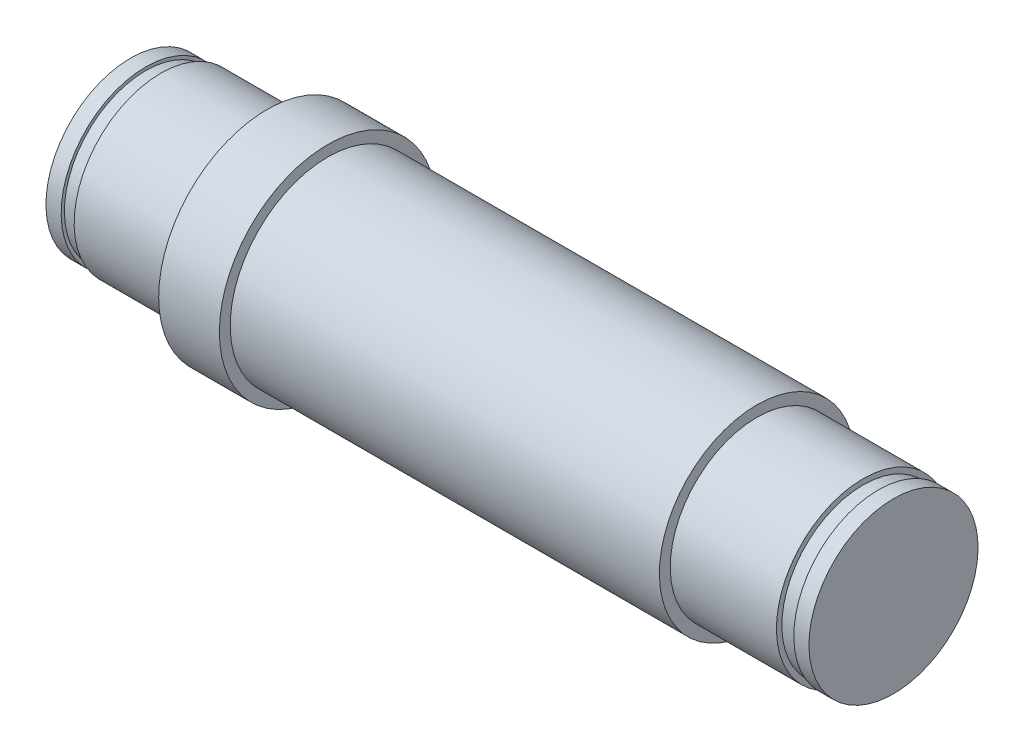
ISO-10303-21;
HEADER;
FILE_DESCRIPTION(('STEP AP214'),'2;1');
FILE_NAME('part.step','',(''),(''),'','','');
FILE_SCHEMA(('AUTOMOTIVE_DESIGN { 1 0 10303 214 1 1 1 1 }'));
ENDSEC;
DATA;
#1=APPLICATION_CONTEXT('core data for automotive mechanical design processes');
#2=APPLICATION_PROTOCOL_DEFINITION('international standard','automotive_design',2000,#1);
#3=PRODUCT_CONTEXT('',#1,'mechanical');
#4=PRODUCT('Part','Part','',(#3));
#5=PRODUCT_RELATED_PRODUCT_CATEGORY('part','',(#4));
#6=PRODUCT_DEFINITION_FORMATION('','',#4);
#7=PRODUCT_DEFINITION_CONTEXT('part definition',#1,'design');
#8=PRODUCT_DEFINITION('design','',#6,#7);
#9=PRODUCT_DEFINITION_SHAPE('','',#8);
#10=(LENGTH_UNIT() NAMED_UNIT(*) SI_UNIT(.MILLI.,.METRE.));
#11=(NAMED_UNIT(*) PLANE_ANGLE_UNIT() SI_UNIT($,.RADIAN.));
#12=(NAMED_UNIT(*) SI_UNIT($,.STERADIAN.) SOLID_ANGLE_UNIT());
#13=UNCERTAINTY_MEASURE_WITH_UNIT(LENGTH_MEASURE(1.E-05),#10,'distance_accuracy_value','');
#14=(GEOMETRIC_REPRESENTATION_CONTEXT(3) GLOBAL_UNCERTAINTY_ASSIGNED_CONTEXT((#13)) GLOBAL_UNIT_ASSIGNED_CONTEXT((#10,
#11,#12)) REPRESENTATION_CONTEXT('',''));
#15=CARTESIAN_POINT('',(0.,0.,0.));
#16=DIRECTION('',(0.,0.,1.));
#17=DIRECTION('',(1.,0.,0.));
#18=AXIS2_PLACEMENT_3D('',#15,#16,#17);
#19=CARTESIAN_POINT('',(17.6,3.89999999999999,0.));
#20=DIRECTION('',(1.,0.,0.));
#21=DIRECTION('',(0.,1.,0.));
#22=AXIS2_PLACEMENT_3D('',#19,#20,#21);
#23=PLANE('',#22);
#24=CARTESIAN_POINT('',(17.6,0.,0.));
#25=DIRECTION('',(1.,0.,0.));
#26=DIRECTION('',(0.,1.,0.));
#27=AXIS2_PLACEMENT_3D('',#24,#25,#26);
#28=CIRCLE('',#27,3.89999999999998);
#29=CARTESIAN_POINT('',(17.6,3.89999999999999,0.));
#30=VERTEX_POINT('',#29);
#31=EDGE_CURVE('E83',#30,#30,#28,.T.);
#32=ORIENTED_EDGE('',*,*,#31,.T.);
#33=EDGE_LOOP('',(#32));
#34=FACE_BOUND('',#33,.T.);
#35=ADVANCED_FACE('F37',(#34),#23,.T.);
#36=CARTESIAN_POINT('',(23.0088864336153,0.,0.));
#37=DIRECTION('',(1.,0.,0.));
#38=DIRECTION('',(0.,1.,0.));
#39=AXIS2_PLACEMENT_3D('',#36,#37,#38);
#40=CYLINDRICAL_SURFACE('',#39,4.50000000000122);
#41=CARTESIAN_POINT('',(-8.5,0.,0.));
#42=DIRECTION('',(1.,0.,0.));
#43=DIRECTION('',(0.,0.,-1.));
#44=AXIS2_PLACEMENT_3D('',#41,#42,#43);
#45=CIRCLE('',#44,4.50000000000122);
#46=CARTESIAN_POINT('',(-8.5,0.,-4.50000000000122));
#47=VERTEX_POINT('',#46);
#48=EDGE_CURVE('E10',#47,#47,#45,.F.);
#49=ORIENTED_EDGE('',*,*,#48,.F.);
#50=EDGE_LOOP('',(#49));
#51=FACE_BOUND('',#50,.T.);
#52=CARTESIAN_POINT('',(11.3,0.,0.));
#53=DIRECTION('',(1.,0.,0.));
#54=DIRECTION('',(0.,1.,0.));
#55=AXIS2_PLACEMENT_3D('',#52,#53,#54);
#56=CIRCLE('',#55,4.50000000000122);
#57=CARTESIAN_POINT('',(11.3,4.50000000000123,0.));
#58=VERTEX_POINT('',#57);
#59=EDGE_CURVE('E65',#58,#58,#56,.T.);
#60=ORIENTED_EDGE('',*,*,#59,.F.);
#61=EDGE_LOOP('',(#60));
#62=FACE_BOUND('',#61,.T.);
#63=ADVANCED_FACE('F110',(#51,#62),#40,.T.);
#64=CARTESIAN_POINT('',(11.3,4.50000000000123,0.));
#65=DIRECTION('',(1.,0.,0.));
#66=DIRECTION('',(0.,1.,0.));
#67=AXIS2_PLACEMENT_3D('',#64,#65,#66);
#68=PLANE('',#67);
#69=ORIENTED_EDGE('',*,*,#59,.T.);
#70=EDGE_LOOP('',(#69));
#71=FACE_BOUND('',#70,.T.);
#72=CARTESIAN_POINT('',(11.3,0.,0.));
#73=DIRECTION('',(1.,0.,0.));
#74=DIRECTION('',(0.,1.,0.));
#75=AXIS2_PLACEMENT_3D('',#72,#73,#74);
#76=CIRCLE('',#75,4.);
#77=CARTESIAN_POINT('',(11.3,4.,0.));
#78=VERTEX_POINT('',#77);
#79=EDGE_CURVE('E68',#78,#78,#76,.T.);
#80=ORIENTED_EDGE('',*,*,#79,.F.);
#81=EDGE_LOOP('',(#80));
#82=FACE_BOUND('',#81,.T.);
#83=ADVANCED_FACE('F115',(#71,#82),#68,.T.);
#84=CARTESIAN_POINT('',(23.0088864336153,0.,0.));
#85=DIRECTION('',(1.,0.,0.));
#86=DIRECTION('',(0.,1.,0.));
#87=AXIS2_PLACEMENT_3D('',#84,#85,#86);
#88=CYLINDRICAL_SURFACE('',#87,4.);
#89=ORIENTED_EDGE('',*,*,#79,.T.);
#90=EDGE_LOOP('',(#89));
#91=FACE_BOUND('',#90,.T.);
#92=CARTESIAN_POINT('',(16.2,0.,0.));
#93=DIRECTION('',(1.,0.,0.));
#94=DIRECTION('',(0.,1.,0.));
#95=AXIS2_PLACEMENT_3D('',#92,#93,#94);
#96=CIRCLE('',#95,4.);
#97=CARTESIAN_POINT('',(16.2,4.,0.));
#98=VERTEX_POINT('',#97);
#99=EDGE_CURVE('E71',#98,#98,#96,.T.);
#100=ORIENTED_EDGE('',*,*,#99,.F.);
#101=EDGE_LOOP('',(#100));
#102=FACE_BOUND('',#101,.T.);
#103=ADVANCED_FACE('F123',(#91,#102),#88,.T.);
#104=CARTESIAN_POINT('',(16.2,4.,0.));
#105=DIRECTION('',(1.,0.,0.));
#106=DIRECTION('',(0.,1.,0.));
#107=AXIS2_PLACEMENT_3D('',#104,#105,#106);
#108=PLANE('',#107);
#109=ORIENTED_EDGE('',*,*,#99,.T.);
#110=EDGE_LOOP('',(#109));
#111=FACE_BOUND('',#110,.T.);
#112=CARTESIAN_POINT('',(16.2,0.,0.));
#113=DIRECTION('',(1.,0.,0.));
#114=DIRECTION('',(0.,1.,0.));
#115=AXIS2_PLACEMENT_3D('',#112,#113,#114);
#116=CIRCLE('',#115,3.75);
#117=CARTESIAN_POINT('',(16.2,3.75,0.));
#118=VERTEX_POINT('',#117);
#119=EDGE_CURVE('E74',#118,#118,#116,.T.);
#120=ORIENTED_EDGE('',*,*,#119,.F.);
#121=EDGE_LOOP('',(#120));
#122=FACE_BOUND('',#121,.T.);
#123=ADVANCED_FACE('F226',(#111,#122),#108,.T.);
#124=CARTESIAN_POINT('',(23.0088864336153,0.,0.));
#125=DIRECTION('',(1.,0.,0.));
#126=DIRECTION('',(0.,1.,0.));
#127=AXIS2_PLACEMENT_3D('',#124,#125,#126);
#128=CYLINDRICAL_SURFACE('',#127,3.75);
#129=ORIENTED_EDGE('',*,*,#119,.T.);
#130=EDGE_LOOP('',(#129));
#131=FACE_BOUND('',#130,.T.);
#132=CARTESIAN_POINT('',(16.9,0.,0.));
#133=DIRECTION('',(1.,0.,0.));
#134=DIRECTION('',(0.,1.,0.));
#135=AXIS2_PLACEMENT_3D('',#132,#133,#134);
#136=CIRCLE('',#135,3.75);
#137=CARTESIAN_POINT('',(16.9,3.75,0.));
#138=VERTEX_POINT('',#137);
#139=EDGE_CURVE('E77',#138,#138,#136,.T.);
#140=ORIENTED_EDGE('',*,*,#139,.F.);
#141=EDGE_LOOP('',(#140));
#142=FACE_BOUND('',#141,.T.);
#143=ADVANCED_FACE('F215',(#131,#142),#128,.T.);
#144=CARTESIAN_POINT('',(16.9,3.75,0.));
#145=DIRECTION('',(-1.,0.,0.));
#146=DIRECTION('',(0.,-1.,0.));
#147=AXIS2_PLACEMENT_3D('',#144,#145,#146);
#148=PLANE('',#147);
#149=ORIENTED_EDGE('',*,*,#139,.T.);
#150=EDGE_LOOP('',(#149));
#151=FACE_BOUND('',#150,.T.);
#152=CARTESIAN_POINT('',(16.9,0.,0.));
#153=DIRECTION('',(1.,0.,0.));
#154=DIRECTION('',(0.,1.,0.));
#155=AXIS2_PLACEMENT_3D('',#152,#153,#154);
#156=CIRCLE('',#155,3.89999999999998);
#157=CARTESIAN_POINT('',(16.9,3.89999999999999,0.));
#158=VERTEX_POINT('',#157);
#159=EDGE_CURVE('E80',#158,#158,#156,.T.);
#160=ORIENTED_EDGE('',*,*,#159,.F.);
#161=EDGE_LOOP('',(#160));
#162=FACE_BOUND('',#161,.T.);
#163=ADVANCED_FACE('F106',(#151,#162),#148,.T.);
#164=CARTESIAN_POINT('',(23.0088864336153,0.,0.));
#165=DIRECTION('',(1.,0.,0.));
#166=DIRECTION('',(0.,1.,0.));
#167=AXIS2_PLACEMENT_3D('',#164,#165,#166);
#168=CYLINDRICAL_SURFACE('',#167,3.89999999999998);
#169=ORIENTED_EDGE('',*,*,#159,.T.);
#170=EDGE_LOOP('',(#169));
#171=FACE_BOUND('',#170,.T.);
#172=ORIENTED_EDGE('',*,*,#31,.F.);
#173=EDGE_LOOP('',(#172));
#174=FACE_BOUND('',#173,.T.);
#175=ADVANCED_FACE('F97',(#171,#174),#168,.T.);
#176=CARTESIAN_POINT('',(0.,0.,0.));
#177=DIRECTION('',(1.,0.,0.));
#178=DIRECTION('',(0.,0.,-1.));
#179=AXIS2_PLACEMENT_3D('',#176,#177,#178);
#180=CYLINDRICAL_SURFACE('',#179,5.00000000000123);
#181=CARTESIAN_POINT('',(-11.3,0.,0.));
#182=DIRECTION('',(1.,0.,0.));
#183=DIRECTION('',(0.,0.,-1.));
#184=AXIS2_PLACEMENT_3D('',#181,#182,#183);
#185=CIRCLE('',#184,5.00000000000123);
#186=CARTESIAN_POINT('',(-11.3,0.,-5.00000000000123));
#187=VERTEX_POINT('',#186);
#188=EDGE_CURVE('E86',#187,#187,#185,.T.);
#189=ORIENTED_EDGE('',*,*,#188,.T.);
#190=EDGE_LOOP('',(#189));
#191=FACE_BOUND('',#190,.T.);
#192=CARTESIAN_POINT('',(-8.5,0.,0.));
#193=DIRECTION('',(1.,0.,0.));
#194=DIRECTION('',(0.,0.,-1.));
#195=AXIS2_PLACEMENT_3D('',#192,#193,#194);
#196=CIRCLE('',#195,5.00000000000123);
#197=CARTESIAN_POINT('',(-8.5,0.,-5.00000000000123));
#198=VERTEX_POINT('',#197);
#199=EDGE_CURVE('E89',#198,#198,#196,.T.);
#200=ORIENTED_EDGE('',*,*,#199,.F.);
#201=EDGE_LOOP('',(#200));
#202=FACE_BOUND('',#201,.T.);
#203=ADVANCED_FACE('F95',(#191,#202),#180,.T.);
#204=CARTESIAN_POINT('',(-8.5,4.50000000000123,0.));
#205=DIRECTION('',(1.,0.,0.));
#206=DIRECTION('',(0.,0.,-1.));
#207=AXIS2_PLACEMENT_3D('',#204,#205,#206);
#208=PLANE('',#207);
#209=ORIENTED_EDGE('',*,*,#199,.T.);
#210=EDGE_LOOP('',(#209));
#211=FACE_BOUND('',#210,.T.);
#212=ORIENTED_EDGE('',*,*,#48,.T.);
#213=EDGE_LOOP('',(#212));
#214=FACE_BOUND('',#213,.T.);
#215=ADVANCED_FACE('F93',(#211,#214),#208,.T.);
#216=CARTESIAN_POINT('',(-17.6,0.,0.));
#217=DIRECTION('',(-1.,0.,0.));
#218=DIRECTION('',(0.,-1.,0.));
#219=AXIS2_PLACEMENT_3D('',#216,#217,#218);
#220=PLANE('',#219);
#221=CARTESIAN_POINT('',(-17.6,0.,0.));
#222=DIRECTION('',(1.,0.,0.));
#223=DIRECTION('',(0.,1.,0.));
#224=AXIS2_PLACEMENT_3D('',#221,#222,#223);
#225=CIRCLE('',#224,3.89999999999999);
#226=CARTESIAN_POINT('',(-17.6,3.89999999999999,0.));
#227=VERTEX_POINT('',#226);
#228=EDGE_CURVE('E43',#227,#227,#225,.T.);
#229=ORIENTED_EDGE('',*,*,#228,.F.);
#230=EDGE_LOOP('',(#229));
#231=FACE_BOUND('',#230,.T.);
#232=ADVANCED_FACE('F104',(#231),#220,.T.);
#233=CARTESIAN_POINT('',(23.0088864336153,0.,0.));
#234=DIRECTION('',(1.,0.,0.));
#235=DIRECTION('',(0.,1.,0.));
#236=AXIS2_PLACEMENT_3D('',#233,#234,#235);
#237=CYLINDRICAL_SURFACE('',#236,3.89999999999999);
#238=ORIENTED_EDGE('',*,*,#228,.T.);
#239=EDGE_LOOP('',(#238));
#240=FACE_BOUND('',#239,.T.);
#241=CARTESIAN_POINT('',(-16.9,0.,0.));
#242=DIRECTION('',(1.,0.,0.));
#243=DIRECTION('',(0.,1.,0.));
#244=AXIS2_PLACEMENT_3D('',#241,#242,#243);
#245=CIRCLE('',#244,3.89999999999999);
#246=CARTESIAN_POINT('',(-16.9,3.89999999999999,0.));
#247=VERTEX_POINT('',#246);
#248=EDGE_CURVE('E47',#247,#247,#245,.T.);
#249=ORIENTED_EDGE('',*,*,#248,.F.);
#250=EDGE_LOOP('',(#249));
#251=FACE_BOUND('',#250,.T.);
#252=ADVANCED_FACE('F148',(#240,#251),#237,.T.);
#253=CARTESIAN_POINT('',(-16.9,3.89999999999999,0.));
#254=DIRECTION('',(1.,0.,0.));
#255=DIRECTION('',(0.,1.,0.));
#256=AXIS2_PLACEMENT_3D('',#253,#254,#255);
#257=PLANE('',#256);
#258=ORIENTED_EDGE('',*,*,#248,.T.);
#259=EDGE_LOOP('',(#258));
#260=FACE_BOUND('',#259,.T.);
#261=CARTESIAN_POINT('',(-16.9,0.,0.));
#262=DIRECTION('',(1.,0.,0.));
#263=DIRECTION('',(0.,1.,0.));
#264=AXIS2_PLACEMENT_3D('',#261,#262,#263);
#265=CIRCLE('',#264,3.75);
#266=CARTESIAN_POINT('',(-16.9,3.75,0.));
#267=VERTEX_POINT('',#266);
#268=EDGE_CURVE('E51',#267,#267,#265,.T.);
#269=ORIENTED_EDGE('',*,*,#268,.F.);
#270=EDGE_LOOP('',(#269));
#271=FACE_BOUND('',#270,.T.);
#272=ADVANCED_FACE('F144',(#260,#271),#257,.T.);
#273=CARTESIAN_POINT('',(23.0088864336153,0.,0.));
#274=DIRECTION('',(1.,0.,0.));
#275=DIRECTION('',(0.,1.,0.));
#276=AXIS2_PLACEMENT_3D('',#273,#274,#275);
#277=CYLINDRICAL_SURFACE('',#276,3.75);
#278=ORIENTED_EDGE('',*,*,#268,.T.);
#279=EDGE_LOOP('',(#278));
#280=FACE_BOUND('',#279,.T.);
#281=CARTESIAN_POINT('',(-16.2,0.,0.));
#282=DIRECTION('',(1.,0.,0.));
#283=DIRECTION('',(0.,1.,0.));
#284=AXIS2_PLACEMENT_3D('',#281,#282,#283);
#285=CIRCLE('',#284,3.75);
#286=CARTESIAN_POINT('',(-16.2,3.75,0.));
#287=VERTEX_POINT('',#286);
#288=EDGE_CURVE('E56',#287,#287,#285,.T.);
#289=ORIENTED_EDGE('',*,*,#288,.F.);
#290=EDGE_LOOP('',(#289));
#291=FACE_BOUND('',#290,.T.);
#292=ADVANCED_FACE('F140',(#280,#291),#277,.T.);
#293=CARTESIAN_POINT('',(-16.2,3.75,0.));
#294=DIRECTION('',(-1.,0.,0.));
#295=DIRECTION('',(0.,-1.,0.));
#296=AXIS2_PLACEMENT_3D('',#293,#294,#295);
#297=PLANE('',#296);
#298=ORIENTED_EDGE('',*,*,#288,.T.);
#299=EDGE_LOOP('',(#298));
#300=FACE_BOUND('',#299,.T.);
#301=CARTESIAN_POINT('',(-16.2,0.,0.));
#302=DIRECTION('',(1.,0.,0.));
#303=DIRECTION('',(0.,1.,0.));
#304=AXIS2_PLACEMENT_3D('',#301,#302,#303);
#305=CIRCLE('',#304,4.);
#306=CARTESIAN_POINT('',(-16.2,4.,0.));
#307=VERTEX_POINT('',#306);
#308=EDGE_CURVE('E59',#307,#307,#305,.T.);
#309=ORIENTED_EDGE('',*,*,#308,.F.);
#310=EDGE_LOOP('',(#309));
#311=FACE_BOUND('',#310,.T.);
#312=ADVANCED_FACE('F136',(#300,#311),#297,.T.);
#313=CARTESIAN_POINT('',(23.0088864336153,0.,0.));
#314=DIRECTION('',(1.,0.,0.));
#315=DIRECTION('',(0.,1.,0.));
#316=AXIS2_PLACEMENT_3D('',#313,#314,#315);
#317=CYLINDRICAL_SURFACE('',#316,4.);
#318=ORIENTED_EDGE('',*,*,#308,.T.);
#319=EDGE_LOOP('',(#318));
#320=FACE_BOUND('',#319,.T.);
#321=CARTESIAN_POINT('',(-11.3,0.,0.));
#322=DIRECTION('',(1.,0.,0.));
#323=DIRECTION('',(0.,1.,0.));
#324=AXIS2_PLACEMENT_3D('',#321,#322,#323);
#325=CIRCLE('',#324,4.);
#326=CARTESIAN_POINT('',(-11.3,4.,0.));
#327=VERTEX_POINT('',#326);
#328=EDGE_CURVE('E62',#327,#327,#325,.T.);
#329=ORIENTED_EDGE('',*,*,#328,.F.);
#330=EDGE_LOOP('',(#329));
#331=FACE_BOUND('',#330,.T.);
#332=ADVANCED_FACE('F132',(#320,#331),#317,.T.);
#333=CARTESIAN_POINT('',(-11.3,4.,0.));
#334=DIRECTION('',(-1.,0.,0.));
#335=DIRECTION('',(0.,-1.,0.));
#336=AXIS2_PLACEMENT_3D('',#333,#334,#335);
#337=PLANE('',#336);
#338=ORIENTED_EDGE('',*,*,#328,.T.);
#339=EDGE_LOOP('',(#338));
#340=FACE_BOUND('',#339,.T.);
#341=ORIENTED_EDGE('',*,*,#188,.F.);
#342=EDGE_LOOP('',(#341));
#343=FACE_BOUND('',#342,.T.);
#344=ADVANCED_FACE('F129',(#340,#343),#337,.T.);
#345=CLOSED_SHELL('',(#35,#63,#83,#103,#123,#143,#163,#175,#203,#215,#232,#252,#272,#292,#312,
#332,#344));
#346=MANIFOLD_SOLID_BREP('B2',#345);
#347=ADVANCED_BREP_SHAPE_REPRESENTATION('',(#18,#346),#14);
#348=SHAPE_DEFINITION_REPRESENTATION(#9,#347);
ENDSEC;
END-ISO-10303-21;
